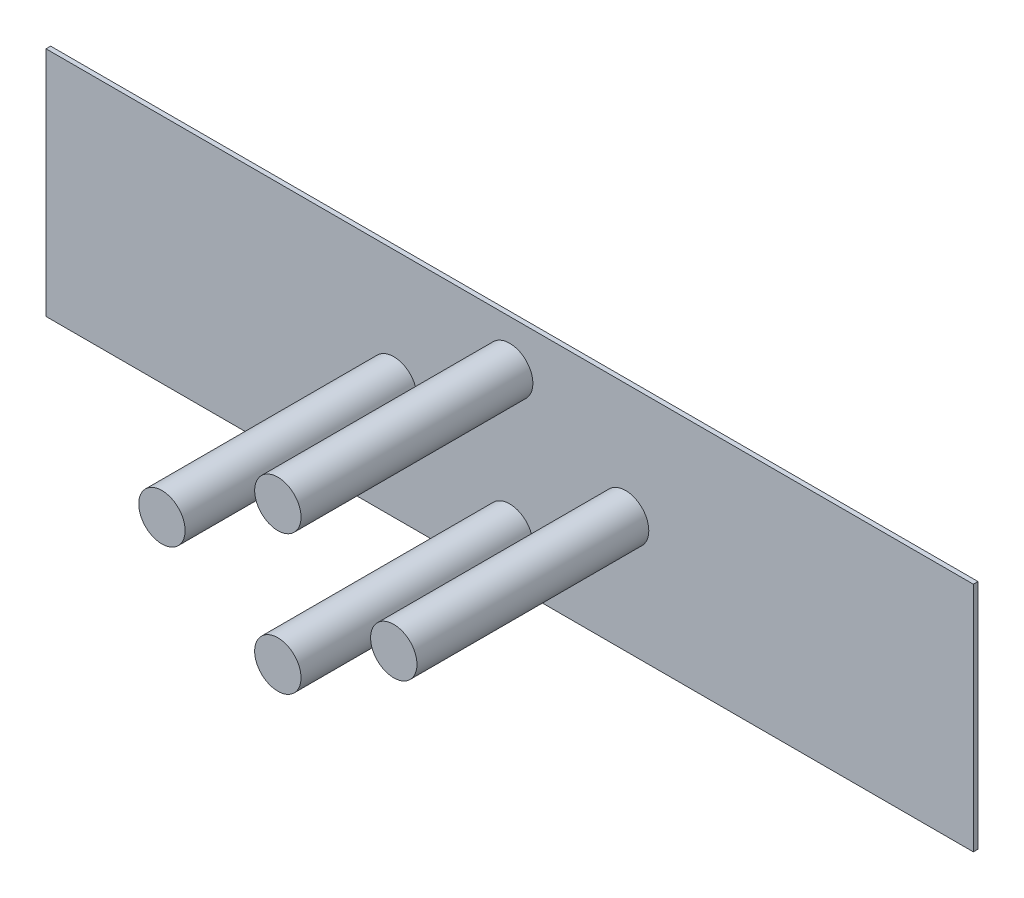
ISO-10303-21;
HEADER;
FILE_DESCRIPTION(('STEP AP214'),'2;1');
FILE_NAME('part.step','',(''),(''),'','','');
FILE_SCHEMA(('AUTOMOTIVE_DESIGN { 1 0 10303 214 1 1 1 1 }'));
ENDSEC;
DATA;
#1=APPLICATION_CONTEXT('core data for automotive mechanical design processes');
#2=APPLICATION_PROTOCOL_DEFINITION('international standard','automotive_design',2000,#1);
#3=PRODUCT_CONTEXT('',#1,'mechanical');
#4=PRODUCT('Part','Part','',(#3));
#5=PRODUCT_RELATED_PRODUCT_CATEGORY('part','',(#4));
#6=PRODUCT_DEFINITION_FORMATION('','',#4);
#7=PRODUCT_DEFINITION_CONTEXT('part definition',#1,'design');
#8=PRODUCT_DEFINITION('design','',#6,#7);
#9=PRODUCT_DEFINITION_SHAPE('','',#8);
#10=(LENGTH_UNIT() NAMED_UNIT(*) SI_UNIT(.MILLI.,.METRE.));
#11=(NAMED_UNIT(*) PLANE_ANGLE_UNIT() SI_UNIT($,.RADIAN.));
#12=(NAMED_UNIT(*) SI_UNIT($,.STERADIAN.) SOLID_ANGLE_UNIT());
#13=UNCERTAINTY_MEASURE_WITH_UNIT(LENGTH_MEASURE(1.E-05),#10,'distance_accuracy_value','');
#14=(GEOMETRIC_REPRESENTATION_CONTEXT(3) GLOBAL_UNCERTAINTY_ASSIGNED_CONTEXT((#13)) GLOBAL_UNIT_ASSIGNED_CONTEXT((#10,
#11,#12)) REPRESENTATION_CONTEXT('',''));
#15=CARTESIAN_POINT('',(0.,0.,0.));
#16=DIRECTION('',(0.,0.,1.));
#17=DIRECTION('',(1.,0.,0.));
#18=AXIS2_PLACEMENT_3D('',#15,#16,#17);
#19=CARTESIAN_POINT('',(5000.00000000001,2500.,-100.));
#20=DIRECTION('',(1.,0.,0.));
#21=DIRECTION('',(0.,1.,0.));
#22=AXIS2_PLACEMENT_3D('',#19,#20,#21);
#23=PLANE('',#22);
#24=DIRECTION('',(0.,1.,0.));
#25=VECTOR('',#24,1.);
#26=CARTESIAN_POINT('',(5000.00000000001,2500.,0.));
#27=LINE('',#26,#25);
#28=CARTESIAN_POINT('',(5000.,-2500.,0.));
#29=VERTEX_POINT('',#28);
#30=CARTESIAN_POINT('',(5000.00000000001,2500.,0.));
#31=VERTEX_POINT('',#30);
#32=EDGE_CURVE('E112',#29,#31,#27,.T.);
#33=ORIENTED_EDGE('',*,*,#32,.F.);
#34=DIRECTION('',(0.,0.,1.));
#35=VECTOR('',#34,1.);
#36=CARTESIAN_POINT('',(5000.,-2500.,-100.));
#37=LINE('',#36,#35);
#38=CARTESIAN_POINT('',(5000.,-2500.,-100.));
#39=VERTEX_POINT('',#38);
#40=EDGE_CURVE('E48',#39,#29,#37,.T.);
#41=ORIENTED_EDGE('',*,*,#40,.F.);
#42=DIRECTION('',(0.,1.,0.));
#43=VECTOR('',#42,1.);
#44=CARTESIAN_POINT('',(5000.00000000001,2500.,-100.));
#45=LINE('',#44,#43);
#46=CARTESIAN_POINT('',(5000.00000000001,2500.,-100.));
#47=VERTEX_POINT('',#46);
#48=EDGE_CURVE('E103',#39,#47,#45,.T.);
#49=ORIENTED_EDGE('',*,*,#48,.T.);
#50=DIRECTION('',(0.,0.,1.));
#51=VECTOR('',#50,1.);
#52=CARTESIAN_POINT('',(5000.00000000001,2500.,-100.));
#53=LINE('',#52,#51);
#54=EDGE_CURVE('E83',#47,#31,#53,.T.);
#55=ORIENTED_EDGE('',*,*,#54,.T.);
#56=EDGE_LOOP('',(#33,#41,#49,#55));
#57=FACE_BOUND('',#56,.T.);
#58=ADVANCED_FACE('F39',(#57),#23,.T.);
#59=CARTESIAN_POINT('',(-15000.,-2500.,-100.));
#60=DIRECTION('',(0.,-1.,0.));
#61=DIRECTION('',(1.,0.,0.));
#62=AXIS2_PLACEMENT_3D('',#59,#60,#61);
#63=PLANE('',#62);
#64=DIRECTION('',(1.,0.,0.));
#65=VECTOR('',#64,1.);
#66=CARTESIAN_POINT('',(-15000.,-2500.,0.));
#67=LINE('',#66,#65);
#68=CARTESIAN_POINT('',(-15000.,-2500.,0.));
#69=VERTEX_POINT('',#68);
#70=EDGE_CURVE('E106',#69,#29,#67,.T.);
#71=ORIENTED_EDGE('',*,*,#70,.F.);
#72=DIRECTION('',(0.,0.,1.));
#73=VECTOR('',#72,1.);
#74=CARTESIAN_POINT('',(-15000.,-2500.,-100.));
#75=LINE('',#74,#73);
#76=CARTESIAN_POINT('',(-15000.,-2500.,-100.));
#77=VERTEX_POINT('',#76);
#78=EDGE_CURVE('E72',#77,#69,#75,.T.);
#79=ORIENTED_EDGE('',*,*,#78,.F.);
#80=DIRECTION('',(1.,0.,0.));
#81=VECTOR('',#80,1.);
#82=CARTESIAN_POINT('',(-15000.,-2500.,-100.));
#83=LINE('',#82,#81);
#84=EDGE_CURVE('E98',#77,#39,#83,.T.);
#85=ORIENTED_EDGE('',*,*,#84,.T.);
#86=ORIENTED_EDGE('',*,*,#40,.T.);
#87=EDGE_LOOP('',(#71,#79,#85,#86));
#88=FACE_BOUND('',#87,.T.);
#89=ADVANCED_FACE('F131',(#88),#63,.T.);
#90=CARTESIAN_POINT('',(-15000.,2500.,-100.));
#91=DIRECTION('',(-1.,0.,0.));
#92=DIRECTION('',(0.,-1.,0.));
#93=AXIS2_PLACEMENT_3D('',#90,#91,#92);
#94=PLANE('',#93);
#95=DIRECTION('',(0.,-1.,0.));
#96=VECTOR('',#95,1.);
#97=CARTESIAN_POINT('',(-15000.,2500.,0.));
#98=LINE('',#97,#96);
#99=CARTESIAN_POINT('',(-15000.,2500.,0.));
#100=VERTEX_POINT('',#99);
#101=EDGE_CURVE('E91',#100,#69,#98,.T.);
#102=ORIENTED_EDGE('',*,*,#101,.F.);
#103=DIRECTION('',(0.,0.,1.));
#104=VECTOR('',#103,1.);
#105=CARTESIAN_POINT('',(-15000.,2500.,-100.));
#106=LINE('',#105,#104);
#107=CARTESIAN_POINT('',(-15000.,2500.,-100.));
#108=VERTEX_POINT('',#107);
#109=EDGE_CURVE('E86',#108,#100,#106,.T.);
#110=ORIENTED_EDGE('',*,*,#109,.F.);
#111=DIRECTION('',(0.,-1.,0.));
#112=VECTOR('',#111,1.);
#113=CARTESIAN_POINT('',(-15000.,2500.,-100.));
#114=LINE('',#113,#112);
#115=EDGE_CURVE('E89',#108,#77,#114,.T.);
#116=ORIENTED_EDGE('',*,*,#115,.T.);
#117=ORIENTED_EDGE('',*,*,#78,.T.);
#118=EDGE_LOOP('',(#102,#110,#116,#117));
#119=FACE_BOUND('',#118,.T.);
#120=ADVANCED_FACE('F88',(#119),#94,.T.);
#121=CARTESIAN_POINT('',(-15000.,2500.,-100.));
#122=DIRECTION('',(0.,1.,0.));
#123=DIRECTION('',(-1.,0.,0.));
#124=AXIS2_PLACEMENT_3D('',#121,#122,#123);
#125=PLANE('',#124);
#126=DIRECTION('',(-1.,0.,0.));
#127=VECTOR('',#126,1.);
#128=CARTESIAN_POINT('',(-15000.,2500.,0.));
#129=LINE('',#128,#127);
#130=EDGE_CURVE('E116',#31,#100,#129,.T.);
#131=ORIENTED_EDGE('',*,*,#130,.F.);
#132=ORIENTED_EDGE('',*,*,#54,.F.);
#133=DIRECTION('',(-1.,0.,0.));
#134=VECTOR('',#133,1.);
#135=CARTESIAN_POINT('',(-15000.,2500.,-100.));
#136=LINE('',#135,#134);
#137=EDGE_CURVE('E97',#47,#108,#136,.T.);
#138=ORIENTED_EDGE('',*,*,#137,.T.);
#139=ORIENTED_EDGE('',*,*,#109,.T.);
#140=EDGE_LOOP('',(#131,#132,#138,#139));
#141=FACE_BOUND('',#140,.T.);
#142=ADVANCED_FACE('F101',(#141),#125,.T.);
#143=CARTESIAN_POINT('',(0.,0.,-100.));
#144=DIRECTION('',(0.,0.,1.));
#145=DIRECTION('',(1.,0.,0.));
#146=AXIS2_PLACEMENT_3D('',#143,#144,#145);
#147=PLANE('',#146);
#148=ORIENTED_EDGE('',*,*,#48,.F.);
#149=ORIENTED_EDGE('',*,*,#84,.F.);
#150=ORIENTED_EDGE('',*,*,#115,.F.);
#151=ORIENTED_EDGE('',*,*,#137,.F.);
#152=EDGE_LOOP('',(#148,#149,#150,#151));
#153=FACE_BOUND('',#152,.T.);
#154=ADVANCED_FACE('F96',(#153),#147,.F.);
#155=CARTESIAN_POINT('',(0.,0.,0.));
#156=DIRECTION('',(0.,0.,1.));
#157=DIRECTION('',(1.,0.,0.));
#158=AXIS2_PLACEMENT_3D('',#155,#156,#157);
#159=PLANE('',#158);
#160=CARTESIAN_POINT('',(-7500.,0.,0.));
#161=DIRECTION('',(0.,0.,1.));
#162=DIRECTION('',(1.,0.,0.));
#163=AXIS2_PLACEMENT_3D('',#160,#161,#162);
#164=CIRCLE('',#163,500.);
#165=CARTESIAN_POINT('',(-7000.,0.,0.));
#166=VERTEX_POINT('',#165);
#167=EDGE_CURVE('E189',#166,#166,#164,.T.);
#168=ORIENTED_EDGE('',*,*,#167,.F.);
#169=EDGE_LOOP('',(#168));
#170=FACE_BOUND('',#169,.T.);
#171=CARTESIAN_POINT('',(-5000.,-1500.,0.));
#172=DIRECTION('',(0.,0.,1.));
#173=DIRECTION('',(1.,0.,0.));
#174=AXIS2_PLACEMENT_3D('',#171,#172,#173);
#175=CIRCLE('',#174,500.);
#176=CARTESIAN_POINT('',(-4500.,-1500.,0.));
#177=VERTEX_POINT('',#176);
#178=EDGE_CURVE('E11',#177,#177,#175,.T.);
#179=ORIENTED_EDGE('',*,*,#178,.F.);
#180=EDGE_LOOP('',(#179));
#181=FACE_BOUND('',#180,.T.);
#182=CARTESIAN_POINT('',(-2500.,0.,0.));
#183=DIRECTION('',(0.,0.,1.));
#184=DIRECTION('',(1.,0.,0.));
#185=AXIS2_PLACEMENT_3D('',#182,#183,#184);
#186=CIRCLE('',#185,500.);
#187=CARTESIAN_POINT('',(-2000.,0.,0.));
#188=VERTEX_POINT('',#187);
#189=EDGE_CURVE('E200',#188,#188,#186,.T.);
#190=ORIENTED_EDGE('',*,*,#189,.F.);
#191=EDGE_LOOP('',(#190));
#192=FACE_BOUND('',#191,.T.);
#193=CARTESIAN_POINT('',(-5000.,1500.,0.));
#194=DIRECTION('',(0.,0.,1.));
#195=DIRECTION('',(1.,0.,0.));
#196=AXIS2_PLACEMENT_3D('',#193,#194,#195);
#197=CIRCLE('',#196,500.);
#198=CARTESIAN_POINT('',(-4500.,1500.,0.));
#199=VERTEX_POINT('',#198);
#200=EDGE_CURVE('E204',#199,#199,#197,.T.);
#201=ORIENTED_EDGE('',*,*,#200,.F.);
#202=EDGE_LOOP('',(#201));
#203=FACE_BOUND('',#202,.T.);
#204=ORIENTED_EDGE('',*,*,#32,.T.);
#205=ORIENTED_EDGE('',*,*,#130,.T.);
#206=ORIENTED_EDGE('',*,*,#101,.T.);
#207=ORIENTED_EDGE('',*,*,#70,.T.);
#208=EDGE_LOOP('',(#204,#205,#206,#207));
#209=FACE_BOUND('',#208,.T.);
#210=ADVANCED_FACE('F130',(#170,#181,#192,#203,#209),#159,.T.);
#211=CARTESIAN_POINT('',(-5000.,1500.,5000.));
#212=DIRECTION('',(0.,0.,-1.));
#213=DIRECTION('',(-1.,0.,0.));
#214=AXIS2_PLACEMENT_3D('',#211,#212,#213);
#215=CYLINDRICAL_SURFACE('',#214,500.);
#216=CARTESIAN_POINT('',(-5000.,1500.,5000.));
#217=DIRECTION('',(0.,0.,1.));
#218=DIRECTION('',(1.,0.,0.));
#219=AXIS2_PLACEMENT_3D('',#216,#217,#218);
#220=CIRCLE('',#219,500.);
#221=CARTESIAN_POINT('',(-4500.,1500.,5000.));
#222=VERTEX_POINT('',#221);
#223=EDGE_CURVE('E117',#222,#222,#220,.T.);
#224=ORIENTED_EDGE('',*,*,#223,.F.);
#225=EDGE_LOOP('',(#224));
#226=FACE_BOUND('',#225,.T.);
#227=ORIENTED_EDGE('',*,*,#200,.T.);
#228=EDGE_LOOP('',(#227));
#229=FACE_BOUND('',#228,.T.);
#230=ADVANCED_FACE('F148',(#226,#229),#215,.T.);
#231=CARTESIAN_POINT('',(0.,0.,5000.));
#232=DIRECTION('',(0.,0.,1.));
#233=DIRECTION('',(1.,0.,0.));
#234=AXIS2_PLACEMENT_3D('',#231,#232,#233);
#235=PLANE('',#234);
#236=ORIENTED_EDGE('',*,*,#223,.T.);
#237=EDGE_LOOP('',(#236));
#238=FACE_BOUND('',#237,.T.);
#239=ADVANCED_FACE('F153',(#238),#235,.T.);
#240=CARTESIAN_POINT('',(-2500.,0.,5000.));
#241=DIRECTION('',(0.,0.,-1.));
#242=DIRECTION('',(-1.,0.,0.));
#243=AXIS2_PLACEMENT_3D('',#240,#241,#242);
#244=CYLINDRICAL_SURFACE('',#243,500.);
#245=CARTESIAN_POINT('',(-2500.,0.,5000.));
#246=DIRECTION('',(0.,0.,1.));
#247=DIRECTION('',(1.,0.,0.));
#248=AXIS2_PLACEMENT_3D('',#245,#246,#247);
#249=CIRCLE('',#248,500.);
#250=CARTESIAN_POINT('',(-2000.,0.,5000.));
#251=VERTEX_POINT('',#250);
#252=EDGE_CURVE('E196',#251,#251,#249,.T.);
#253=ORIENTED_EDGE('',*,*,#252,.F.);
#254=EDGE_LOOP('',(#253));
#255=FACE_BOUND('',#254,.T.);
#256=ORIENTED_EDGE('',*,*,#189,.T.);
#257=EDGE_LOOP('',(#256));
#258=FACE_BOUND('',#257,.T.);
#259=ADVANCED_FACE('F157',(#255,#258),#244,.T.);
#260=CARTESIAN_POINT('',(0.,0.,5000.));
#261=DIRECTION('',(0.,0.,1.));
#262=DIRECTION('',(1.,0.,0.));
#263=AXIS2_PLACEMENT_3D('',#260,#261,#262);
#264=PLANE('',#263);
#265=ORIENTED_EDGE('',*,*,#252,.T.);
#266=EDGE_LOOP('',(#265));
#267=FACE_BOUND('',#266,.T.);
#268=ADVANCED_FACE('F159',(#267),#264,.T.);
#269=CARTESIAN_POINT('',(-5000.,-1500.,5000.));
#270=DIRECTION('',(0.,0.,-1.));
#271=DIRECTION('',(-1.,0.,0.));
#272=AXIS2_PLACEMENT_3D('',#269,#270,#271);
#273=CYLINDRICAL_SURFACE('',#272,500.);
#274=CARTESIAN_POINT('',(-5000.,-1500.,5000.));
#275=DIRECTION('',(0.,0.,1.));
#276=DIRECTION('',(1.,0.,0.));
#277=AXIS2_PLACEMENT_3D('',#274,#275,#276);
#278=CIRCLE('',#277,500.);
#279=CARTESIAN_POINT('',(-4500.,-1500.,5000.));
#280=VERTEX_POINT('',#279);
#281=EDGE_CURVE('E191',#280,#280,#278,.F.);
#282=ORIENTED_EDGE('',*,*,#281,.T.);
#283=EDGE_LOOP('',(#282));
#284=FACE_BOUND('',#283,.T.);
#285=ORIENTED_EDGE('',*,*,#178,.T.);
#286=EDGE_LOOP('',(#285));
#287=FACE_BOUND('',#286,.T.);
#288=ADVANCED_FACE('F162',(#284,#287),#273,.T.);
#289=CARTESIAN_POINT('',(0.,0.,5000.));
#290=DIRECTION('',(0.,0.,1.));
#291=DIRECTION('',(1.,0.,0.));
#292=AXIS2_PLACEMENT_3D('',#289,#290,#291);
#293=PLANE('',#292);
#294=ORIENTED_EDGE('',*,*,#281,.F.);
#295=EDGE_LOOP('',(#294));
#296=FACE_BOUND('',#295,.T.);
#297=ADVANCED_FACE('F167',(#296),#293,.T.);
#298=CARTESIAN_POINT('',(-7500.,0.,5000.));
#299=DIRECTION('',(0.,0.,-1.));
#300=DIRECTION('',(-1.,0.,0.));
#301=AXIS2_PLACEMENT_3D('',#298,#299,#300);
#302=CYLINDRICAL_SURFACE('',#301,500.);
#303=CARTESIAN_POINT('',(-7500.,0.,5000.));
#304=DIRECTION('',(0.,0.,1.));
#305=DIRECTION('',(1.,0.,0.));
#306=AXIS2_PLACEMENT_3D('',#303,#304,#305);
#307=CIRCLE('',#306,500.);
#308=CARTESIAN_POINT('',(-7000.,0.,5000.));
#309=VERTEX_POINT('',#308);
#310=EDGE_CURVE('E186',#309,#309,#307,.T.);
#311=ORIENTED_EDGE('',*,*,#310,.F.);
#312=EDGE_LOOP('',(#311));
#313=FACE_BOUND('',#312,.T.);
#314=ORIENTED_EDGE('',*,*,#167,.T.);
#315=EDGE_LOOP('',(#314));
#316=FACE_BOUND('',#315,.T.);
#317=ADVANCED_FACE('F170',(#313,#316),#302,.T.);
#318=CARTESIAN_POINT('',(-7500.,0.,5000.));
#319=DIRECTION('',(0.,0.,1.));
#320=DIRECTION('',(1.,0.,0.));
#321=AXIS2_PLACEMENT_3D('',#318,#319,#320);
#322=PLANE('',#321);
#323=ORIENTED_EDGE('',*,*,#310,.T.);
#324=EDGE_LOOP('',(#323));
#325=FACE_BOUND('',#324,.T.);
#326=ADVANCED_FACE('F175',(#325),#322,.T.);
#327=CLOSED_SHELL('',(#58,#89,#120,#142,#154,#210,#230,#239,#259,#268,#288,#297,#317,#326));
#328=MANIFOLD_SOLID_BREP('B2',#327);
#329=ADVANCED_BREP_SHAPE_REPRESENTATION('',(#18,#328),#14);
#330=SHAPE_DEFINITION_REPRESENTATION(#9,#329);
ENDSEC;
END-ISO-10303-21;
